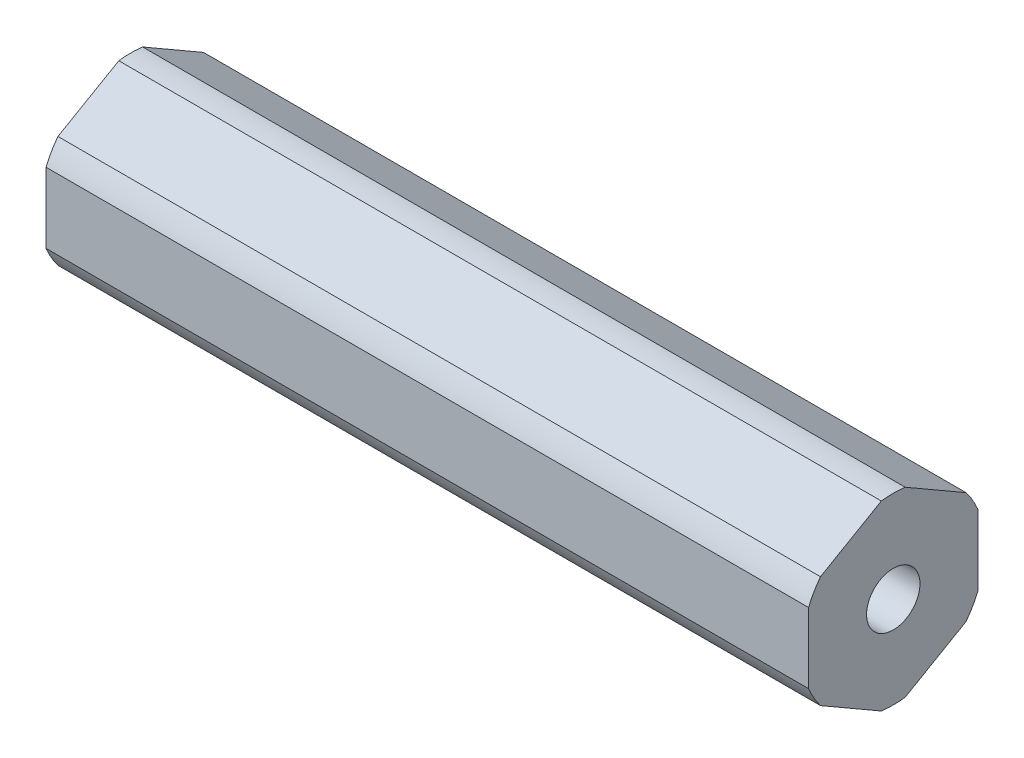
ISO-10303-21;
HEADER;
FILE_DESCRIPTION(('STEP AP214'),'2;1');
FILE_NAME('part.step','',(''),(''),'','','');
FILE_SCHEMA(('AUTOMOTIVE_DESIGN { 1 0 10303 214 1 1 1 1 }'));
ENDSEC;
DATA;
#1=APPLICATION_CONTEXT('core data for automotive mechanical design processes');
#2=APPLICATION_PROTOCOL_DEFINITION('international standard','automotive_design',2000,#1);
#3=PRODUCT_CONTEXT('',#1,'mechanical');
#4=PRODUCT('Part','Part','',(#3));
#5=PRODUCT_RELATED_PRODUCT_CATEGORY('part','',(#4));
#6=PRODUCT_DEFINITION_FORMATION('','',#4);
#7=PRODUCT_DEFINITION_CONTEXT('part definition',#1,'design');
#8=PRODUCT_DEFINITION('design','',#6,#7);
#9=PRODUCT_DEFINITION_SHAPE('','',#8);
#10=(LENGTH_UNIT() NAMED_UNIT(*) SI_UNIT(.MILLI.,.METRE.));
#11=(NAMED_UNIT(*) PLANE_ANGLE_UNIT() SI_UNIT($,.RADIAN.));
#12=(NAMED_UNIT(*) SI_UNIT($,.STERADIAN.) SOLID_ANGLE_UNIT());
#13=UNCERTAINTY_MEASURE_WITH_UNIT(LENGTH_MEASURE(1.E-05),#10,'distance_accuracy_value','');
#14=(GEOMETRIC_REPRESENTATION_CONTEXT(3) GLOBAL_UNCERTAINTY_ASSIGNED_CONTEXT((#13)) GLOBAL_UNIT_ASSIGNED_CONTEXT((#10,
#11,#12)) REPRESENTATION_CONTEXT('',''));
#15=CARTESIAN_POINT('',(0.,0.,0.));
#16=DIRECTION('',(0.,0.,1.));
#17=DIRECTION('',(1.,0.,0.));
#18=AXIS2_PLACEMENT_3D('',#15,#16,#17);
#19=CARTESIAN_POINT('',(344.4875,301.019463238127,252.617915112614));
#20=DIRECTION('',(0.,-0.866025403784441,-0.5));
#21=DIRECTION('',(0.,0.5,-0.866025403784441));
#22=AXIS2_PLACEMENT_3D('',#19,#20,#21);
#23=PLANE('',#22);
#24=DIRECTION('',(-1.,0.,0.));
#25=VECTOR('',#24,1.);
#26=CARTESIAN_POINT('',(344.4875,302.336294495322,250.337096470158));
#27=LINE('',#26,#25);
#28=CARTESIAN_POINT('',(344.4875,302.336294495322,250.337096470158));
#29=VERTEX_POINT('',#28);
#30=CARTESIAN_POINT('',(287.3375,302.336294495322,250.337096470158));
#31=VERTEX_POINT('',#30);
#32=EDGE_CURVE('E184',#29,#31,#27,.T.);
#33=ORIENTED_EDGE('',*,*,#32,.T.);
#34=DIRECTION('',(0.,0.5,-0.866025403784441));
#35=VECTOR('',#34,1.);
#36=CARTESIAN_POINT('',(287.3375,301.019463238127,252.617915112614));
#37=LINE('',#36,#35);
#38=CARTESIAN_POINT('',(287.3375,299.702631980932,254.89873375507));
#39=VERTEX_POINT('',#38);
#40=EDGE_CURVE('E143',#39,#31,#37,.T.);
#41=ORIENTED_EDGE('',*,*,#40,.F.);
#42=DIRECTION('',(-1.,0.,0.));
#43=VECTOR('',#42,1.);
#44=CARTESIAN_POINT('',(344.4875,299.702631980932,254.89873375507));
#45=LINE('',#44,#43);
#46=CARTESIAN_POINT('',(344.4875,299.702631980932,254.89873375507));
#47=VERTEX_POINT('',#46);
#48=EDGE_CURVE('E187',#39,#47,#45,.F.);
#49=ORIENTED_EDGE('',*,*,#48,.T.);
#50=DIRECTION('',(0.,-0.5,0.866025403784441));
#51=VECTOR('',#50,1.);
#52=CARTESIAN_POINT('',(344.4875,301.019463238127,252.617915112614));
#53=LINE('',#52,#51);
#54=EDGE_CURVE('E195',#29,#47,#53,.T.);
#55=ORIENTED_EDGE('',*,*,#54,.F.);
#56=EDGE_LOOP('',(#33,#41,#49,#55));
#57=FACE_BOUND('',#56,.T.);
#58=ADVANCED_FACE('F17',(#57),#23,.F.);
#59=CARTESIAN_POINT('',(344.4875,295.519728238127,255.793188595336));
#60=DIRECTION('',(0.,0.,-1.));
#61=DIRECTION('',(-1.,0.,0.));
#62=AXIS2_PLACEMENT_3D('',#59,#60,#61);
#63=PLANE('',#62);
#64=DIRECTION('',(-1.,0.,0.));
#65=VECTOR('',#64,1.);
#66=CARTESIAN_POINT('',(344.4875,298.153390752516,255.793188595336));
#67=LINE('',#66,#65);
#68=CARTESIAN_POINT('',(344.4875,298.153390752516,255.793188595336));
#69=VERTEX_POINT('',#68);
#70=CARTESIAN_POINT('',(287.3375,298.153390752516,255.793188595336));
#71=VERTEX_POINT('',#70);
#72=EDGE_CURVE('E118',#69,#71,#67,.T.);
#73=ORIENTED_EDGE('',*,*,#72,.T.);
#74=DIRECTION('',(0.,1.,0.));
#75=VECTOR('',#74,1.);
#76=CARTESIAN_POINT('',(287.3375,295.519728238127,255.793188595336));
#77=LINE('',#76,#75);
#78=CARTESIAN_POINT('',(287.3375,292.886065723737,255.793188595336));
#79=VERTEX_POINT('',#78);
#80=EDGE_CURVE('E136',#79,#71,#77,.T.);
#81=ORIENTED_EDGE('',*,*,#80,.F.);
#82=DIRECTION('',(-1.,0.,0.));
#83=VECTOR('',#82,1.);
#84=CARTESIAN_POINT('',(344.4875,292.886065723737,255.793188595336));
#85=LINE('',#84,#83);
#86=CARTESIAN_POINT('',(344.4875,292.886065723737,255.793188595336));
#87=VERTEX_POINT('',#86);
#88=EDGE_CURVE('E180',#79,#87,#85,.F.);
#89=ORIENTED_EDGE('',*,*,#88,.T.);
#90=DIRECTION('',(0.,-1.,0.));
#91=VECTOR('',#90,1.);
#92=CARTESIAN_POINT('',(344.4875,295.519728238127,255.793188595336));
#93=LINE('',#92,#91);
#94=EDGE_CURVE('E199',#69,#87,#93,.T.);
#95=ORIENTED_EDGE('',*,*,#94,.F.);
#96=EDGE_LOOP('',(#73,#81,#89,#95));
#97=FACE_BOUND('',#96,.T.);
#98=ADVANCED_FACE('F265',(#97),#63,.F.);
#99=CARTESIAN_POINT('',(344.4875,290.019993238127,252.617915112614));
#100=DIRECTION('',(0.,0.866025403784441,-0.5));
#101=DIRECTION('',(0.,0.5,0.866025403784441));
#102=AXIS2_PLACEMENT_3D('',#99,#100,#101);
#103=PLANE('',#102);
#104=DIRECTION('',(-1.,0.,0.));
#105=VECTOR('',#104,1.);
#106=CARTESIAN_POINT('',(344.4875,291.336824495321,254.89873375507));
#107=LINE('',#106,#105);
#108=CARTESIAN_POINT('',(344.4875,291.336824495321,254.89873375507));
#109=VERTEX_POINT('',#108);
#110=CARTESIAN_POINT('',(287.3375,291.336824495321,254.89873375507));
#111=VERTEX_POINT('',#110);
#112=EDGE_CURVE('E119',#109,#111,#107,.T.);
#113=ORIENTED_EDGE('',*,*,#112,.T.);
#114=DIRECTION('',(0.,0.5,0.866025403784441));
#115=VECTOR('',#114,1.);
#116=CARTESIAN_POINT('',(287.3375,290.019993238127,252.617915112614));
#117=LINE('',#116,#115);
#118=CARTESIAN_POINT('',(287.3375,288.703161980932,250.337096470158));
#119=VERTEX_POINT('',#118);
#120=EDGE_CURVE('E125',#119,#111,#117,.T.);
#121=ORIENTED_EDGE('',*,*,#120,.F.);
#122=DIRECTION('',(-1.,0.,0.));
#123=VECTOR('',#122,1.);
#124=CARTESIAN_POINT('',(344.4875,288.703161980932,250.337096470158));
#125=LINE('',#124,#123);
#126=CARTESIAN_POINT('',(344.4875,288.703161980932,250.337096470158));
#127=VERTEX_POINT('',#126);
#128=EDGE_CURVE('E106',#119,#127,#125,.F.);
#129=ORIENTED_EDGE('',*,*,#128,.T.);
#130=DIRECTION('',(0.,-0.5,-0.866025403784441));
#131=VECTOR('',#130,1.);
#132=CARTESIAN_POINT('',(344.4875,290.019993238127,252.617915112614));
#133=LINE('',#132,#131);
#134=EDGE_CURVE('E203',#109,#127,#133,.T.);
#135=ORIENTED_EDGE('',*,*,#134,.F.);
#136=EDGE_LOOP('',(#113,#121,#129,#135));
#137=FACE_BOUND('',#136,.T.);
#138=ADVANCED_FACE('F133',(#137),#103,.F.);
#139=CARTESIAN_POINT('',(344.4875,290.019993238127,246.267368147171));
#140=DIRECTION('',(0.,0.866025403784441,0.5));
#141=DIRECTION('',(0.,-0.5,0.866025403784441));
#142=AXIS2_PLACEMENT_3D('',#139,#140,#141);
#143=PLANE('',#142);
#144=DIRECTION('',(-1.,0.,0.));
#145=VECTOR('',#144,1.);
#146=CARTESIAN_POINT('',(344.4875,288.703161980932,248.548186789627));
#147=LINE('',#146,#145);
#148=CARTESIAN_POINT('',(344.4875,288.703161980932,248.548186789627));
#149=VERTEX_POINT('',#148);
#150=CARTESIAN_POINT('',(287.3375,288.703161980932,248.548186789627));
#151=VERTEX_POINT('',#150);
#152=EDGE_CURVE('E169',#149,#151,#147,.T.);
#153=ORIENTED_EDGE('',*,*,#152,.T.);
#154=DIRECTION('',(0.,-0.5,0.866025403784441));
#155=VECTOR('',#154,1.);
#156=CARTESIAN_POINT('',(287.3375,290.019993238127,246.267368147171));
#157=LINE('',#156,#155);
#158=CARTESIAN_POINT('',(287.3375,291.336824495321,243.986549504715));
#159=VERTEX_POINT('',#158);
#160=EDGE_CURVE('E128',#159,#151,#157,.T.);
#161=ORIENTED_EDGE('',*,*,#160,.F.);
#162=DIRECTION('',(-1.,0.,0.));
#163=VECTOR('',#162,1.);
#164=CARTESIAN_POINT('',(344.4875,291.336824495321,243.986549504715));
#165=LINE('',#164,#163);
#166=CARTESIAN_POINT('',(344.4875,291.336824495321,243.986549504715));
#167=VERTEX_POINT('',#166);
#168=EDGE_CURVE('E172',#159,#167,#165,.F.);
#169=ORIENTED_EDGE('',*,*,#168,.T.);
#170=DIRECTION('',(0.,0.5,-0.866025403784441));
#171=VECTOR('',#170,1.);
#172=CARTESIAN_POINT('',(344.4875,290.019993238127,246.267368147171));
#173=LINE('',#172,#171);
#174=EDGE_CURVE('E206',#149,#167,#173,.T.);
#175=ORIENTED_EDGE('',*,*,#174,.F.);
#176=EDGE_LOOP('',(#153,#161,#169,#175));
#177=FACE_BOUND('',#176,.T.);
#178=ADVANCED_FACE('F284',(#177),#143,.F.);
#179=CARTESIAN_POINT('',(344.4875,295.519728238127,243.092094664449));
#180=DIRECTION('',(0.,0.,1.));
#181=DIRECTION('',(1.,0.,0.));
#182=AXIS2_PLACEMENT_3D('',#179,#180,#181);
#183=PLANE('',#182);
#184=DIRECTION('',(-1.,0.,0.));
#185=VECTOR('',#184,1.);
#186=CARTESIAN_POINT('',(344.4875,292.886065723737,243.092094664449));
#187=LINE('',#186,#185);
#188=CARTESIAN_POINT('',(344.4875,292.886065723737,243.092094664449));
#189=VERTEX_POINT('',#188);
#190=CARTESIAN_POINT('',(287.3375,292.886065723737,243.092094664449));
#191=VERTEX_POINT('',#190);
#192=EDGE_CURVE('E162',#189,#191,#187,.T.);
#193=ORIENTED_EDGE('',*,*,#192,.T.);
#194=DIRECTION('',(0.,-1.,0.));
#195=VECTOR('',#194,1.);
#196=CARTESIAN_POINT('',(287.3375,295.519728238127,243.092094664449));
#197=LINE('',#196,#195);
#198=CARTESIAN_POINT('',(287.3375,298.153390752516,243.092094664449));
#199=VERTEX_POINT('',#198);
#200=EDGE_CURVE('E146',#199,#191,#197,.T.);
#201=ORIENTED_EDGE('',*,*,#200,.F.);
#202=DIRECTION('',(-1.,0.,0.));
#203=VECTOR('',#202,1.);
#204=CARTESIAN_POINT('',(344.4875,298.153390752516,243.092094664449));
#205=LINE('',#204,#203);
#206=CARTESIAN_POINT('',(344.4875,298.153390752516,243.092094664449));
#207=VERTEX_POINT('',#206);
#208=EDGE_CURVE('E165',#199,#207,#205,.F.);
#209=ORIENTED_EDGE('',*,*,#208,.T.);
#210=DIRECTION('',(0.,1.,0.));
#211=VECTOR('',#210,1.);
#212=CARTESIAN_POINT('',(344.4875,295.519728238127,243.092094664449));
#213=LINE('',#212,#211);
#214=EDGE_CURVE('E25',#189,#207,#213,.T.);
#215=ORIENTED_EDGE('',*,*,#214,.F.);
#216=EDGE_LOOP('',(#193,#201,#209,#215));
#217=FACE_BOUND('',#216,.T.);
#218=ADVANCED_FACE('F218',(#217),#183,.F.);
#219=CARTESIAN_POINT('',(344.4875,301.019463238127,246.267368147171));
#220=DIRECTION('',(0.,-0.866025403784441,0.5));
#221=DIRECTION('',(0.,-0.5,-0.866025403784441));
#222=AXIS2_PLACEMENT_3D('',#219,#220,#221);
#223=PLANE('',#222);
#224=DIRECTION('',(-1.,0.,0.));
#225=VECTOR('',#224,1.);
#226=CARTESIAN_POINT('',(344.4875,299.702631980932,243.986549504715));
#227=LINE('',#226,#225);
#228=CARTESIAN_POINT('',(344.4875,299.702631980932,243.986549504715));
#229=VERTEX_POINT('',#228);
#230=CARTESIAN_POINT('',(287.3375,299.702631980932,243.986549504715));
#231=VERTEX_POINT('',#230);
#232=EDGE_CURVE('E40',#229,#231,#227,.T.);
#233=ORIENTED_EDGE('',*,*,#232,.T.);
#234=DIRECTION('',(0.,-0.5,-0.866025403784441));
#235=VECTOR('',#234,1.);
#236=CARTESIAN_POINT('',(287.3375,301.019463238127,246.267368147171));
#237=LINE('',#236,#235);
#238=CARTESIAN_POINT('',(287.3375,302.336294495322,248.548186789627));
#239=VERTEX_POINT('',#238);
#240=EDGE_CURVE('E228',#239,#231,#237,.T.);
#241=ORIENTED_EDGE('',*,*,#240,.F.);
#242=DIRECTION('',(-1.,0.,0.));
#243=VECTOR('',#242,1.);
#244=CARTESIAN_POINT('',(344.4875,302.336294495322,248.548186789627));
#245=LINE('',#244,#243);
#246=CARTESIAN_POINT('',(344.4875,302.336294495322,248.548186789627));
#247=VERTEX_POINT('',#246);
#248=EDGE_CURVE('E159',#239,#247,#245,.F.);
#249=ORIENTED_EDGE('',*,*,#248,.T.);
#250=DIRECTION('',(0.,0.5,0.866025403784441));
#251=VECTOR('',#250,1.);
#252=CARTESIAN_POINT('',(344.4875,301.019463238127,246.267368147171));
#253=LINE('',#252,#251);
#254=EDGE_CURVE('E11',#229,#247,#253,.T.);
#255=ORIENTED_EDGE('',*,*,#254,.F.);
#256=EDGE_LOOP('',(#233,#241,#249,#255));
#257=FACE_BOUND('',#256,.T.);
#258=ADVANCED_FACE('F261',(#257),#223,.F.);
#259=CARTESIAN_POINT('',(344.4875,295.519728238127,249.442641629892));
#260=DIRECTION('',(1.,0.,0.));
#261=DIRECTION('',(0.,1.,0.));
#262=AXIS2_PLACEMENT_3D('',#259,#260,#261);
#263=PLANE('',#262);
#264=CARTESIAN_POINT('',(344.4875,295.519728238127,249.442641629892));
#265=DIRECTION('',(1.,0.,0.));
#266=DIRECTION('',(0.,1.,0.));
#267=AXIS2_PLACEMENT_3D('',#264,#265,#266);
#268=CIRCLE('',#267,2.);
#269=CARTESIAN_POINT('',(344.4875,297.519728238127,249.442641629892));
#270=VERTEX_POINT('',#269);
#271=EDGE_CURVE('E191',#270,#270,#268,.T.);
#272=ORIENTED_EDGE('',*,*,#271,.F.);
#273=EDGE_LOOP('',(#272));
#274=FACE_BOUND('',#273,.T.);
#275=ORIENTED_EDGE('',*,*,#54,.T.);
#276=CARTESIAN_POINT('',(344.4875,295.519728238127,249.442641629892));
#277=DIRECTION('',(1.,0.,0.));
#278=DIRECTION('',(0.,1.,0.));
#279=AXIS2_PLACEMENT_3D('',#276,#277,#278);
#280=CIRCLE('',#279,6.875);
#281=EDGE_CURVE('E156',#47,#69,#280,.T.);
#282=ORIENTED_EDGE('',*,*,#281,.T.);
#283=ORIENTED_EDGE('',*,*,#94,.T.);
#284=EDGE_CURVE('E243',#87,#109,#280,.T.);
#285=ORIENTED_EDGE('',*,*,#284,.T.);
#286=ORIENTED_EDGE('',*,*,#134,.T.);
#287=EDGE_CURVE('E112',#127,#149,#280,.T.);
#288=ORIENTED_EDGE('',*,*,#287,.T.);
#289=ORIENTED_EDGE('',*,*,#174,.T.);
#290=EDGE_CURVE('E216',#167,#189,#280,.T.);
#291=ORIENTED_EDGE('',*,*,#290,.T.);
#292=ORIENTED_EDGE('',*,*,#214,.T.);
#293=EDGE_CURVE('E155',#207,#229,#280,.T.);
#294=ORIENTED_EDGE('',*,*,#293,.T.);
#295=ORIENTED_EDGE('',*,*,#254,.T.);
#296=EDGE_CURVE('E32',#247,#29,#280,.T.);
#297=ORIENTED_EDGE('',*,*,#296,.T.);
#298=EDGE_LOOP('',(#275,#282,#283,#285,#286,#288,#289,#291,#292,#294,#295,#297));
#299=FACE_BOUND('',#298,.T.);
#300=ADVANCED_FACE('F214',(#274,#299),#263,.T.);
#301=CARTESIAN_POINT('',(344.4875,295.519728238127,249.442641629892));
#302=DIRECTION('',(-1.,0.,0.));
#303=DIRECTION('',(0.,-1.,0.));
#304=AXIS2_PLACEMENT_3D('',#301,#302,#303);
#305=CYLINDRICAL_SURFACE('',#304,2.);
#306=ORIENTED_EDGE('',*,*,#271,.T.);
#307=EDGE_LOOP('',(#306));
#308=FACE_BOUND('',#307,.T.);
#309=CARTESIAN_POINT('',(287.3375,295.519728238127,249.442641629892));
#310=DIRECTION('',(-1.,0.,0.));
#311=DIRECTION('',(0.,-1.,0.));
#312=AXIS2_PLACEMENT_3D('',#309,#310,#311);
#313=CIRCLE('',#312,2.);
#314=CARTESIAN_POINT('',(287.3375,293.519728238127,249.442641629892));
#315=VERTEX_POINT('',#314);
#316=EDGE_CURVE('E235',#315,#315,#313,.T.);
#317=ORIENTED_EDGE('',*,*,#316,.T.);
#318=EDGE_LOOP('',(#317));
#319=FACE_BOUND('',#318,.T.);
#320=ADVANCED_FACE('F295',(#308,#319),#305,.F.);
#321=CARTESIAN_POINT('',(344.4875,295.519728238127,249.442641629892));
#322=DIRECTION('',(-1.,0.,0.));
#323=DIRECTION('',(0.,-1.,0.));
#324=AXIS2_PLACEMENT_3D('',#321,#322,#323);
#325=CYLINDRICAL_SURFACE('',#324,6.875);
#326=ORIENTED_EDGE('',*,*,#208,.F.);
#327=CARTESIAN_POINT('',(287.3375,295.519728238127,249.442641629892));
#328=DIRECTION('',(-1.,0.,0.));
#329=DIRECTION('',(0.,-1.,0.));
#330=AXIS2_PLACEMENT_3D('',#327,#328,#329);
#331=CIRCLE('',#330,6.875);
#332=EDGE_CURVE('E224',#231,#199,#331,.T.);
#333=ORIENTED_EDGE('',*,*,#332,.F.);
#334=ORIENTED_EDGE('',*,*,#232,.F.);
#335=ORIENTED_EDGE('',*,*,#293,.F.);
#336=EDGE_LOOP('',(#326,#333,#334,#335));
#337=FACE_BOUND('',#336,.T.);
#338=ADVANCED_FACE('F223',(#337),#325,.T.);
#339=ORIENTED_EDGE('',*,*,#296,.F.);
#340=ORIENTED_EDGE('',*,*,#248,.F.);
#341=EDGE_CURVE('E230',#31,#239,#331,.T.);
#342=ORIENTED_EDGE('',*,*,#341,.F.);
#343=ORIENTED_EDGE('',*,*,#32,.F.);
#344=EDGE_LOOP('',(#339,#340,#342,#343));
#345=FACE_BOUND('',#344,.T.);
#346=ADVANCED_FACE('F259',(#345),#325,.T.);
#347=ORIENTED_EDGE('',*,*,#168,.F.);
#348=EDGE_CURVE('E130',#191,#159,#331,.T.);
#349=ORIENTED_EDGE('',*,*,#348,.F.);
#350=ORIENTED_EDGE('',*,*,#192,.F.);
#351=ORIENTED_EDGE('',*,*,#290,.F.);
#352=EDGE_LOOP('',(#347,#349,#350,#351));
#353=FACE_BOUND('',#352,.T.);
#354=ADVANCED_FACE('F275',(#353),#325,.T.);
#355=ORIENTED_EDGE('',*,*,#128,.F.);
#356=EDGE_CURVE('E109',#151,#119,#331,.T.);
#357=ORIENTED_EDGE('',*,*,#356,.F.);
#358=ORIENTED_EDGE('',*,*,#152,.F.);
#359=ORIENTED_EDGE('',*,*,#287,.F.);
#360=EDGE_LOOP('',(#355,#357,#358,#359));
#361=FACE_BOUND('',#360,.T.);
#362=ADVANCED_FACE('F108',(#361),#325,.T.);
#363=ORIENTED_EDGE('',*,*,#88,.F.);
#364=EDGE_CURVE('E132',#111,#79,#331,.T.);
#365=ORIENTED_EDGE('',*,*,#364,.F.);
#366=ORIENTED_EDGE('',*,*,#112,.F.);
#367=ORIENTED_EDGE('',*,*,#284,.F.);
#368=EDGE_LOOP('',(#363,#365,#366,#367));
#369=FACE_BOUND('',#368,.T.);
#370=ADVANCED_FACE('F267',(#369),#325,.T.);
#371=ORIENTED_EDGE('',*,*,#48,.F.);
#372=EDGE_CURVE('E233',#71,#39,#331,.T.);
#373=ORIENTED_EDGE('',*,*,#372,.F.);
#374=ORIENTED_EDGE('',*,*,#72,.F.);
#375=ORIENTED_EDGE('',*,*,#281,.F.);
#376=EDGE_LOOP('',(#371,#373,#374,#375));
#377=FACE_BOUND('',#376,.T.);
#378=ADVANCED_FACE('F269',(#377),#325,.T.);
#379=CARTESIAN_POINT('',(287.3375,295.519728238127,249.442641629892));
#380=DIRECTION('',(-1.,0.,0.));
#381=DIRECTION('',(0.,1.,0.));
#382=AXIS2_PLACEMENT_3D('',#379,#380,#381);
#383=PLANE('',#382);
#384=ORIENTED_EDGE('',*,*,#316,.F.);
#385=EDGE_LOOP('',(#384));
#386=FACE_BOUND('',#385,.T.);
#387=ORIENTED_EDGE('',*,*,#120,.T.);
#388=ORIENTED_EDGE('',*,*,#364,.T.);
#389=ORIENTED_EDGE('',*,*,#80,.T.);
#390=ORIENTED_EDGE('',*,*,#372,.T.);
#391=ORIENTED_EDGE('',*,*,#40,.T.);
#392=ORIENTED_EDGE('',*,*,#341,.T.);
#393=ORIENTED_EDGE('',*,*,#240,.T.);
#394=ORIENTED_EDGE('',*,*,#332,.T.);
#395=ORIENTED_EDGE('',*,*,#200,.T.);
#396=ORIENTED_EDGE('',*,*,#348,.T.);
#397=ORIENTED_EDGE('',*,*,#160,.T.);
#398=ORIENTED_EDGE('',*,*,#356,.T.);
#399=EDGE_LOOP('',(#387,#388,#389,#390,#391,#392,#393,#394,#395,#396,#397,#398));
#400=FACE_BOUND('',#399,.T.);
#401=ADVANCED_FACE('F123',(#386,#400),#383,.T.);
#402=CLOSED_SHELL('',(#58,#98,#138,#178,#218,#258,#300,#320,#338,#346,#354,#362,#370,#378,#401));
#403=MANIFOLD_SOLID_BREP('B1',#402);
#404=ADVANCED_BREP_SHAPE_REPRESENTATION('',(#18,#403),#14);
#405=SHAPE_DEFINITION_REPRESENTATION(#9,#404);
ENDSEC;
END-ISO-10303-21;
